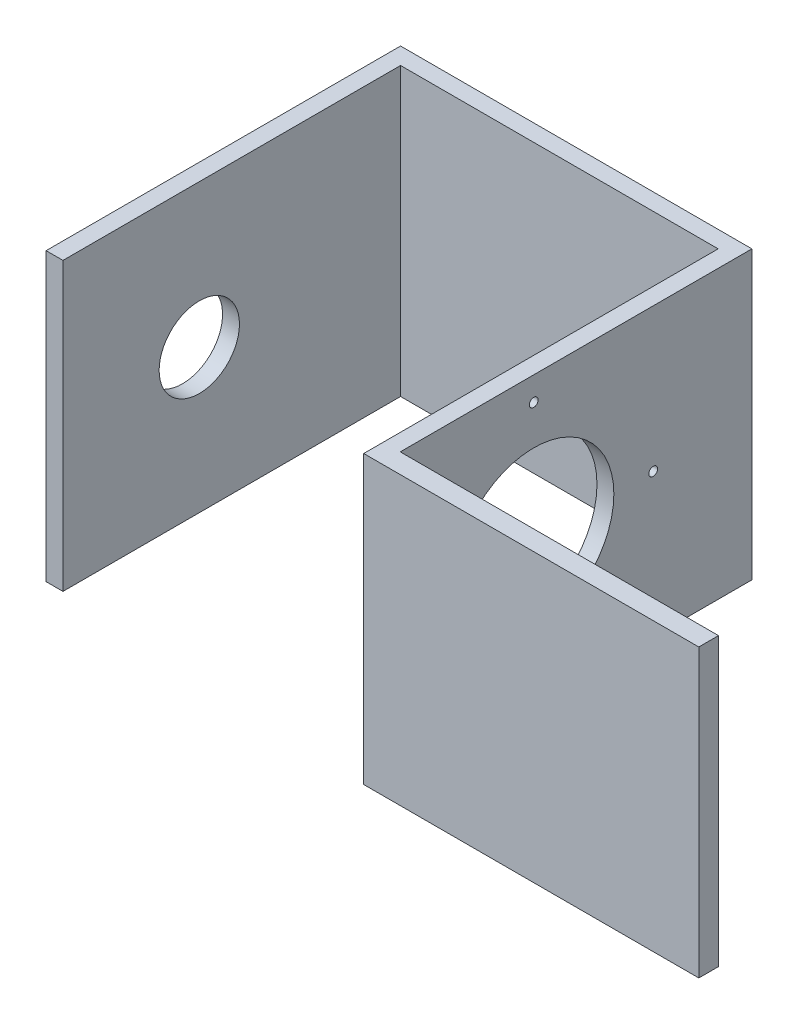
ISO-10303-21;
HEADER;
FILE_DESCRIPTION(('STEP AP214'),'2;1');
FILE_NAME('part.step','',(''),(''),'','','');
FILE_SCHEMA(('AUTOMOTIVE_DESIGN { 1 0 10303 214 1 1 1 1 }'));
ENDSEC;
DATA;
#1=APPLICATION_CONTEXT('core data for automotive mechanical design processes');
#2=APPLICATION_PROTOCOL_DEFINITION('international standard','automotive_design',2000,#1);
#3=PRODUCT_CONTEXT('',#1,'mechanical');
#4=PRODUCT('Part','Part','',(#3));
#5=PRODUCT_RELATED_PRODUCT_CATEGORY('part','',(#4));
#6=PRODUCT_DEFINITION_FORMATION('','',#4);
#7=PRODUCT_DEFINITION_CONTEXT('part definition',#1,'design');
#8=PRODUCT_DEFINITION('design','',#6,#7);
#9=PRODUCT_DEFINITION_SHAPE('','',#8);
#10=(LENGTH_UNIT() NAMED_UNIT(*) SI_UNIT(.MILLI.,.METRE.));
#11=(NAMED_UNIT(*) PLANE_ANGLE_UNIT() SI_UNIT($,.RADIAN.));
#12=(NAMED_UNIT(*) SI_UNIT($,.STERADIAN.) SOLID_ANGLE_UNIT());
#13=UNCERTAINTY_MEASURE_WITH_UNIT(LENGTH_MEASURE(1.E-05),#10,'distance_accuracy_value','');
#14=(GEOMETRIC_REPRESENTATION_CONTEXT(3) GLOBAL_UNCERTAINTY_ASSIGNED_CONTEXT((#13)) GLOBAL_UNIT_ASSIGNED_CONTEXT((#10,
#11,#12)) REPRESENTATION_CONTEXT('',''));
#15=CARTESIAN_POINT('',(0.,0.,0.));
#16=DIRECTION('',(0.,0.,1.));
#17=DIRECTION('',(1.,0.,0.));
#18=AXIS2_PLACEMENT_3D('',#15,#16,#17);
#19=CARTESIAN_POINT('',(175.723,51.,0.));
#20=DIRECTION('',(1.,0.,0.));
#21=DIRECTION('',(0.,0.,-1.));
#22=AXIS2_PLACEMENT_3D('',#19,#20,#21);
#23=PLANE('',#22);
#24=DIRECTION('',(0.,-1.,0.));
#25=VECTOR('',#24,1.);
#26=CARTESIAN_POINT('',(175.723,51.,54.5));
#27=LINE('',#26,#25);
#28=CARTESIAN_POINT('',(175.723,51.,54.5));
#29=VERTEX_POINT('',#28);
#30=CARTESIAN_POINT('',(175.723,-51.,54.5));
#31=VERTEX_POINT('',#30);
#32=EDGE_CURVE('E134',#29,#31,#27,.T.);
#33=ORIENTED_EDGE('',*,*,#32,.T.);
#34=DIRECTION('',(0.,0.,1.));
#35=VECTOR('',#34,1.);
#36=CARTESIAN_POINT('',(175.723,-51.,0.));
#37=LINE('',#36,#35);
#38=CARTESIAN_POINT('',(175.723,-51.,47.5));
#39=VERTEX_POINT('',#38);
#40=EDGE_CURVE('E133',#39,#31,#37,.T.);
#41=ORIENTED_EDGE('',*,*,#40,.F.);
#42=DIRECTION('',(0.,-1.,0.));
#43=VECTOR('',#42,1.);
#44=CARTESIAN_POINT('',(175.723,51.,47.5));
#45=LINE('',#44,#43);
#46=CARTESIAN_POINT('',(175.723,51.,47.5));
#47=VERTEX_POINT('',#46);
#48=EDGE_CURVE('E11',#47,#39,#45,.T.);
#49=ORIENTED_EDGE('',*,*,#48,.F.);
#50=DIRECTION('',(0.,0.,1.));
#51=VECTOR('',#50,1.);
#52=CARTESIAN_POINT('',(175.723,51.,0.));
#53=LINE('',#52,#51);
#54=EDGE_CURVE('E179',#47,#29,#53,.T.);
#55=ORIENTED_EDGE('',*,*,#54,.T.);
#56=EDGE_LOOP('',(#33,#41,#49,#55));
#57=FACE_BOUND('',#56,.T.);
#58=ADVANCED_FACE('F47',(#57),#23,.T.);
#59=CARTESIAN_POINT('',(0.,51.,47.5));
#60=DIRECTION('',(0.,0.,1.));
#61=DIRECTION('',(1.,0.,0.));
#62=AXIS2_PLACEMENT_3D('',#59,#60,#61);
#63=PLANE('',#62);
#64=ORIENTED_EDGE('',*,*,#48,.T.);
#65=DIRECTION('',(-1.,0.,0.));
#66=VECTOR('',#65,1.);
#67=CARTESIAN_POINT('',(0.,-51.,47.5));
#68=LINE('',#67,#66);
#69=CARTESIAN_POINT('',(62.5,-51.,47.5));
#70=VERTEX_POINT('',#69);
#71=EDGE_CURVE('E128',#39,#70,#68,.T.);
#72=ORIENTED_EDGE('',*,*,#71,.T.);
#73=DIRECTION('',(0.,-1.,0.));
#74=VECTOR('',#73,1.);
#75=CARTESIAN_POINT('',(62.5,51.,47.5));
#76=LINE('',#75,#74);
#77=CARTESIAN_POINT('',(62.5,51.,47.5));
#78=VERTEX_POINT('',#77);
#79=EDGE_CURVE('E55',#78,#70,#76,.T.);
#80=ORIENTED_EDGE('',*,*,#79,.F.);
#81=DIRECTION('',(-1.,0.,0.));
#82=VECTOR('',#81,1.);
#83=CARTESIAN_POINT('',(0.,51.,47.5));
#84=LINE('',#83,#82);
#85=EDGE_CURVE('E129',#47,#78,#84,.T.);
#86=ORIENTED_EDGE('',*,*,#85,.F.);
#87=EDGE_LOOP('',(#64,#72,#80,#86));
#88=FACE_BOUND('',#87,.T.);
#89=ADVANCED_FACE('F125',(#88),#63,.F.);
#90=CARTESIAN_POINT('',(62.5,51.,0.));
#91=DIRECTION('',(1.,0.,0.));
#92=DIRECTION('',(0.,0.,-1.));
#93=AXIS2_PLACEMENT_3D('',#90,#91,#92);
#94=PLANE('',#93);
#95=CARTESIAN_POINT('',(62.5,42.5,0.));
#96=DIRECTION('',(1.,0.,0.));
#97=DIRECTION('',(0.,0.,-1.));
#98=AXIS2_PLACEMENT_3D('',#95,#96,#97);
#99=CIRCLE('',#98,1.5635);
#100=CARTESIAN_POINT('',(62.5,42.5,-1.56350000000001));
#101=VERTEX_POINT('',#100);
#102=EDGE_CURVE('E425',#101,#101,#99,.T.);
#103=ORIENTED_EDGE('',*,*,#102,.F.);
#104=EDGE_LOOP('',(#103));
#105=FACE_BOUND('',#104,.T.);
#106=CARTESIAN_POINT('',(62.5,0.,42.5));
#107=DIRECTION('',(1.,0.,0.));
#108=DIRECTION('',(0.,0.,-1.));
#109=AXIS2_PLACEMENT_3D('',#106,#107,#108);
#110=CIRCLE('',#109,1.5635);
#111=CARTESIAN_POINT('',(62.5,0.,40.9365));
#112=VERTEX_POINT('',#111);
#113=EDGE_CURVE('E430',#112,#112,#110,.T.);
#114=ORIENTED_EDGE('',*,*,#113,.F.);
#115=EDGE_LOOP('',(#114));
#116=FACE_BOUND('',#115,.T.);
#117=CARTESIAN_POINT('',(62.5,-42.5,0.));
#118=DIRECTION('',(1.,0.,0.));
#119=DIRECTION('',(0.,0.,-1.));
#120=AXIS2_PLACEMENT_3D('',#117,#118,#119);
#121=CIRCLE('',#120,1.5635);
#122=CARTESIAN_POINT('',(62.5,-42.5,-1.56350000000001));
#123=VERTEX_POINT('',#122);
#124=EDGE_CURVE('E435',#123,#123,#121,.T.);
#125=ORIENTED_EDGE('',*,*,#124,.F.);
#126=EDGE_LOOP('',(#125));
#127=FACE_BOUND('',#126,.T.);
#128=CARTESIAN_POINT('',(62.5,0.,-42.5));
#129=DIRECTION('',(1.,0.,0.));
#130=DIRECTION('',(0.,0.,-1.));
#131=AXIS2_PLACEMENT_3D('',#128,#129,#130);
#132=CIRCLE('',#131,1.5635);
#133=CARTESIAN_POINT('',(62.5,0.,-44.0635));
#134=VERTEX_POINT('',#133);
#135=EDGE_CURVE('E421',#134,#134,#132,.T.);
#136=ORIENTED_EDGE('',*,*,#135,.F.);
#137=EDGE_LOOP('',(#136));
#138=FACE_BOUND('',#137,.T.);
#139=CARTESIAN_POINT('',(62.5,0.,0.));
#140=DIRECTION('',(1.,0.,0.));
#141=DIRECTION('',(0.,0.,-1.));
#142=AXIS2_PLACEMENT_3D('',#139,#140,#141);
#143=CIRCLE('',#142,28.5);
#144=CARTESIAN_POINT('',(62.5,0.,-28.5));
#145=VERTEX_POINT('',#144);
#146=EDGE_CURVE('E415',#145,#145,#143,.T.);
#147=ORIENTED_EDGE('',*,*,#146,.F.);
#148=EDGE_LOOP('',(#147));
#149=FACE_BOUND('',#148,.T.);
#150=ORIENTED_EDGE('',*,*,#79,.T.);
#151=DIRECTION('',(0.,0.,1.));
#152=VECTOR('',#151,1.);
#153=CARTESIAN_POINT('',(62.5,-51.,0.));
#154=LINE('',#153,#152);
#155=CARTESIAN_POINT('',(62.5,-51.,-77.6115));
#156=VERTEX_POINT('',#155);
#157=EDGE_CURVE('E145',#156,#70,#154,.T.);
#158=ORIENTED_EDGE('',*,*,#157,.F.);
#159=DIRECTION('',(0.,-1.,0.));
#160=VECTOR('',#159,1.);
#161=CARTESIAN_POINT('',(62.5,51.,-77.6115));
#162=LINE('',#161,#160);
#163=CARTESIAN_POINT('',(62.5,51.,-77.6115));
#164=VERTEX_POINT('',#163);
#165=EDGE_CURVE('E231',#164,#156,#162,.T.);
#166=ORIENTED_EDGE('',*,*,#165,.F.);
#167=DIRECTION('',(0.,0.,1.));
#168=VECTOR('',#167,1.);
#169=CARTESIAN_POINT('',(62.5,51.,0.));
#170=LINE('',#169,#168);
#171=EDGE_CURVE('E184',#164,#78,#170,.T.);
#172=ORIENTED_EDGE('',*,*,#171,.T.);
#173=EDGE_LOOP('',(#150,#158,#166,#172));
#174=FACE_BOUND('',#173,.T.);
#175=ADVANCED_FACE('F235',(#105,#116,#127,#138,#149,#174),#94,.T.);
#176=CARTESIAN_POINT('',(0.,51.,-77.6115));
#177=DIRECTION('',(0.,0.,1.));
#178=DIRECTION('',(1.,0.,0.));
#179=AXIS2_PLACEMENT_3D('',#176,#177,#178);
#180=PLANE('',#179);
#181=ORIENTED_EDGE('',*,*,#165,.T.);
#182=DIRECTION('',(-1.,0.,0.));
#183=VECTOR('',#182,1.);
#184=CARTESIAN_POINT('',(0.,-51.,-77.6115));
#185=LINE('',#184,#183);
#186=CARTESIAN_POINT('',(-62.5,-51.,-77.6115));
#187=VERTEX_POINT('',#186);
#188=EDGE_CURVE('E149',#156,#187,#185,.T.);
#189=ORIENTED_EDGE('',*,*,#188,.T.);
#190=DIRECTION('',(0.,-1.,0.));
#191=VECTOR('',#190,1.);
#192=CARTESIAN_POINT('',(-62.5,51.,-77.6115));
#193=LINE('',#192,#191);
#194=CARTESIAN_POINT('',(-62.5,51.,-77.6115));
#195=VERTEX_POINT('',#194);
#196=EDGE_CURVE('E228',#195,#187,#193,.T.);
#197=ORIENTED_EDGE('',*,*,#196,.F.);
#198=DIRECTION('',(-1.,0.,0.));
#199=VECTOR('',#198,1.);
#200=CARTESIAN_POINT('',(0.,51.,-77.6115));
#201=LINE('',#200,#199);
#202=EDGE_CURVE('E188',#164,#195,#201,.T.);
#203=ORIENTED_EDGE('',*,*,#202,.F.);
#204=EDGE_LOOP('',(#181,#189,#197,#203));
#205=FACE_BOUND('',#204,.T.);
#206=ADVANCED_FACE('F243',(#205),#180,.F.);
#207=CARTESIAN_POINT('',(-62.5,51.,0.));
#208=DIRECTION('',(-1.,0.,0.));
#209=DIRECTION('',(0.,0.,1.));
#210=AXIS2_PLACEMENT_3D('',#207,#208,#209);
#211=PLANE('',#210);
#212=CARTESIAN_POINT('',(-62.5,0.,0.));
#213=DIRECTION('',(-1.,0.,0.));
#214=DIRECTION('',(0.,0.,1.));
#215=AXIS2_PLACEMENT_3D('',#212,#213,#214);
#216=CIRCLE('',#215,14.2875);
#217=CARTESIAN_POINT('',(-62.5,0.,14.2875));
#218=VERTEX_POINT('',#217);
#219=EDGE_CURVE('E450',#218,#218,#216,.T.);
#220=ORIENTED_EDGE('',*,*,#219,.F.);
#221=EDGE_LOOP('',(#220));
#222=FACE_BOUND('',#221,.T.);
#223=ORIENTED_EDGE('',*,*,#196,.T.);
#224=DIRECTION('',(0.,0.,-1.));
#225=VECTOR('',#224,1.);
#226=CARTESIAN_POINT('',(-62.5,-51.,0.));
#227=LINE('',#226,#225);
#228=CARTESIAN_POINT('',(-62.5,-51.,48.5));
#229=VERTEX_POINT('',#228);
#230=EDGE_CURVE('E156',#229,#187,#227,.T.);
#231=ORIENTED_EDGE('',*,*,#230,.F.);
#232=DIRECTION('',(0.,-1.,0.));
#233=VECTOR('',#232,1.);
#234=CARTESIAN_POINT('',(-62.5,51.,48.5));
#235=LINE('',#234,#233);
#236=CARTESIAN_POINT('',(-62.5,51.,48.5));
#237=VERTEX_POINT('',#236);
#238=EDGE_CURVE('E225',#237,#229,#235,.T.);
#239=ORIENTED_EDGE('',*,*,#238,.F.);
#240=DIRECTION('',(0.,0.,-1.));
#241=VECTOR('',#240,1.);
#242=CARTESIAN_POINT('',(-62.5,51.,0.));
#243=LINE('',#242,#241);
#244=EDGE_CURVE('E191',#237,#195,#243,.T.);
#245=ORIENTED_EDGE('',*,*,#244,.T.);
#246=EDGE_LOOP('',(#223,#231,#239,#245));
#247=FACE_BOUND('',#246,.T.);
#248=ADVANCED_FACE('F246',(#222,#247),#211,.T.);
#249=CARTESIAN_POINT('',(0.,51.,48.5));
#250=DIRECTION('',(0.,0.,1.));
#251=DIRECTION('',(1.,0.,0.));
#252=AXIS2_PLACEMENT_3D('',#249,#250,#251);
#253=PLANE('',#252);
#254=ORIENTED_EDGE('',*,*,#238,.T.);
#255=DIRECTION('',(-1.,0.,0.));
#256=VECTOR('',#255,1.);
#257=CARTESIAN_POINT('',(0.,-51.,48.5));
#258=LINE('',#257,#256);
#259=CARTESIAN_POINT('',(-56.5,-51.,48.5));
#260=VERTEX_POINT('',#259);
#261=EDGE_CURVE('E160',#260,#229,#258,.T.);
#262=ORIENTED_EDGE('',*,*,#261,.F.);
#263=DIRECTION('',(0.,-1.,0.));
#264=VECTOR('',#263,1.);
#265=CARTESIAN_POINT('',(-56.5,51.,48.5));
#266=LINE('',#265,#264);
#267=CARTESIAN_POINT('',(-56.5,51.,48.5));
#268=VERTEX_POINT('',#267);
#269=EDGE_CURVE('E222',#268,#260,#266,.T.);
#270=ORIENTED_EDGE('',*,*,#269,.F.);
#271=DIRECTION('',(-1.,0.,0.));
#272=VECTOR('',#271,1.);
#273=CARTESIAN_POINT('',(0.,51.,48.5));
#274=LINE('',#273,#272);
#275=EDGE_CURVE('E195',#268,#237,#274,.T.);
#276=ORIENTED_EDGE('',*,*,#275,.T.);
#277=EDGE_LOOP('',(#254,#262,#270,#276));
#278=FACE_BOUND('',#277,.T.);
#279=ADVANCED_FACE('F249',(#278),#253,.T.);
#280=CARTESIAN_POINT('',(-56.5,51.,0.));
#281=DIRECTION('',(1.,0.,0.));
#282=DIRECTION('',(0.,0.,-1.));
#283=AXIS2_PLACEMENT_3D('',#280,#281,#282);
#284=PLANE('',#283);
#285=CARTESIAN_POINT('',(-56.5,0.,0.));
#286=DIRECTION('',(1.,0.,0.));
#287=DIRECTION('',(0.,0.,-1.));
#288=AXIS2_PLACEMENT_3D('',#285,#286,#287);
#289=CIRCLE('',#288,14.2875);
#290=CARTESIAN_POINT('',(-56.5,0.,-14.2875));
#291=VERTEX_POINT('',#290);
#292=EDGE_CURVE('E457',#291,#291,#289,.F.);
#293=ORIENTED_EDGE('',*,*,#292,.T.);
#294=EDGE_LOOP('',(#293));
#295=FACE_BOUND('',#294,.T.);
#296=ORIENTED_EDGE('',*,*,#269,.T.);
#297=DIRECTION('',(0.,0.,1.));
#298=VECTOR('',#297,1.);
#299=CARTESIAN_POINT('',(-56.5,-51.,0.));
#300=LINE('',#299,#298);
#301=CARTESIAN_POINT('',(-56.5,-51.,-71.6115));
#302=VERTEX_POINT('',#301);
#303=EDGE_CURVE('E164',#302,#260,#300,.T.);
#304=ORIENTED_EDGE('',*,*,#303,.F.);
#305=DIRECTION('',(0.,-1.,0.));
#306=VECTOR('',#305,1.);
#307=CARTESIAN_POINT('',(-56.5,51.,-71.6115));
#308=LINE('',#307,#306);
#309=CARTESIAN_POINT('',(-56.5,51.,-71.6115));
#310=VERTEX_POINT('',#309);
#311=EDGE_CURVE('E219',#310,#302,#308,.T.);
#312=ORIENTED_EDGE('',*,*,#311,.F.);
#313=DIRECTION('',(0.,0.,1.));
#314=VECTOR('',#313,1.);
#315=CARTESIAN_POINT('',(-56.5,51.,0.));
#316=LINE('',#315,#314);
#317=EDGE_CURVE('E199',#310,#268,#316,.T.);
#318=ORIENTED_EDGE('',*,*,#317,.T.);
#319=EDGE_LOOP('',(#296,#304,#312,#318));
#320=FACE_BOUND('',#319,.T.);
#321=ADVANCED_FACE('F254',(#295,#320),#284,.T.);
#322=CARTESIAN_POINT('',(0.,51.,-71.6115));
#323=DIRECTION('',(0.,0.,1.));
#324=DIRECTION('',(1.,0.,0.));
#325=AXIS2_PLACEMENT_3D('',#322,#323,#324);
#326=PLANE('',#325);
#327=ORIENTED_EDGE('',*,*,#311,.T.);
#328=DIRECTION('',(-1.,0.,0.));
#329=VECTOR('',#328,1.);
#330=CARTESIAN_POINT('',(0.,-51.,-71.6115));
#331=LINE('',#330,#329);
#332=CARTESIAN_POINT('',(56.5,-51.,-71.6115));
#333=VERTEX_POINT('',#332);
#334=EDGE_CURVE('E168',#333,#302,#331,.T.);
#335=ORIENTED_EDGE('',*,*,#334,.F.);
#336=DIRECTION('',(0.,-1.,0.));
#337=VECTOR('',#336,1.);
#338=CARTESIAN_POINT('',(56.5,51.,-71.6115));
#339=LINE('',#338,#337);
#340=CARTESIAN_POINT('',(56.5,51.,-71.6115));
#341=VERTEX_POINT('',#340);
#342=EDGE_CURVE('E216',#341,#333,#339,.T.);
#343=ORIENTED_EDGE('',*,*,#342,.F.);
#344=DIRECTION('',(-1.,0.,0.));
#345=VECTOR('',#344,1.);
#346=CARTESIAN_POINT('',(0.,51.,-71.6115));
#347=LINE('',#346,#345);
#348=EDGE_CURVE('E203',#341,#310,#347,.T.);
#349=ORIENTED_EDGE('',*,*,#348,.T.);
#350=EDGE_LOOP('',(#327,#335,#343,#349));
#351=FACE_BOUND('',#350,.T.);
#352=ADVANCED_FACE('F257',(#351),#326,.T.);
#353=CARTESIAN_POINT('',(56.5,51.,0.));
#354=DIRECTION('',(1.,0.,0.));
#355=DIRECTION('',(0.,0.,-1.));
#356=AXIS2_PLACEMENT_3D('',#353,#354,#355);
#357=PLANE('',#356);
#358=CARTESIAN_POINT('',(56.5,42.5,0.));
#359=DIRECTION('',(1.,0.,0.));
#360=DIRECTION('',(0.,0.,-1.));
#361=AXIS2_PLACEMENT_3D('',#358,#359,#360);
#362=CIRCLE('',#361,1.5635);
#363=CARTESIAN_POINT('',(56.5,42.5,-1.56350000000001));
#364=VERTEX_POINT('',#363);
#365=EDGE_CURVE('E139',#364,#364,#362,.F.);
#366=ORIENTED_EDGE('',*,*,#365,.F.);
#367=EDGE_LOOP('',(#366));
#368=FACE_BOUND('',#367,.T.);
#369=CARTESIAN_POINT('',(56.5,0.,42.5));
#370=DIRECTION('',(1.,0.,0.));
#371=DIRECTION('',(0.,0.,-1.));
#372=AXIS2_PLACEMENT_3D('',#369,#370,#371);
#373=CIRCLE('',#372,1.5635);
#374=CARTESIAN_POINT('',(56.5,0.,40.9365));
#375=VERTEX_POINT('',#374);
#376=EDGE_CURVE('E447',#375,#375,#373,.F.);
#377=ORIENTED_EDGE('',*,*,#376,.F.);
#378=EDGE_LOOP('',(#377));
#379=FACE_BOUND('',#378,.T.);
#380=CARTESIAN_POINT('',(56.5,-42.5,0.));
#381=DIRECTION('',(1.,0.,0.));
#382=DIRECTION('',(0.,0.,-1.));
#383=AXIS2_PLACEMENT_3D('',#380,#381,#382);
#384=CIRCLE('',#383,1.5635);
#385=CARTESIAN_POINT('',(56.5,-42.5,-1.56350000000001));
#386=VERTEX_POINT('',#385);
#387=EDGE_CURVE('E440',#386,#386,#384,.F.);
#388=ORIENTED_EDGE('',*,*,#387,.F.);
#389=EDGE_LOOP('',(#388));
#390=FACE_BOUND('',#389,.T.);
#391=CARTESIAN_POINT('',(56.5,0.,-42.5));
#392=DIRECTION('',(1.,0.,0.));
#393=DIRECTION('',(0.,0.,-1.));
#394=AXIS2_PLACEMENT_3D('',#391,#392,#393);
#395=CIRCLE('',#394,1.5635);
#396=CARTESIAN_POINT('',(56.5,0.,-44.0635));
#397=VERTEX_POINT('',#396);
#398=EDGE_CURVE('E428',#397,#397,#395,.F.);
#399=ORIENTED_EDGE('',*,*,#398,.F.);
#400=EDGE_LOOP('',(#399));
#401=FACE_BOUND('',#400,.T.);
#402=CARTESIAN_POINT('',(56.5,0.,0.));
#403=DIRECTION('',(1.,0.,0.));
#404=DIRECTION('',(0.,0.,-1.));
#405=AXIS2_PLACEMENT_3D('',#402,#403,#404);
#406=CIRCLE('',#405,28.5);
#407=CARTESIAN_POINT('',(56.5,0.,-28.5));
#408=VERTEX_POINT('',#407);
#409=EDGE_CURVE('E418',#408,#408,#406,.F.);
#410=ORIENTED_EDGE('',*,*,#409,.F.);
#411=EDGE_LOOP('',(#410));
#412=FACE_BOUND('',#411,.T.);
#413=ORIENTED_EDGE('',*,*,#342,.T.);
#414=DIRECTION('',(0.,0.,1.));
#415=VECTOR('',#414,1.);
#416=CARTESIAN_POINT('',(56.5,-51.,0.));
#417=LINE('',#416,#415);
#418=CARTESIAN_POINT('',(56.5,-51.,54.5));
#419=VERTEX_POINT('',#418);
#420=EDGE_CURVE('E172',#333,#419,#417,.T.);
#421=ORIENTED_EDGE('',*,*,#420,.T.);
#422=DIRECTION('',(0.,-1.,0.));
#423=VECTOR('',#422,1.);
#424=CARTESIAN_POINT('',(56.5,51.,54.5));
#425=LINE('',#424,#423);
#426=CARTESIAN_POINT('',(56.5,51.,54.5));
#427=VERTEX_POINT('',#426);
#428=EDGE_CURVE('E213',#427,#419,#425,.T.);
#429=ORIENTED_EDGE('',*,*,#428,.F.);
#430=DIRECTION('',(0.,0.,1.));
#431=VECTOR('',#430,1.);
#432=CARTESIAN_POINT('',(56.5,51.,0.));
#433=LINE('',#432,#431);
#434=EDGE_CURVE('E67',#341,#427,#433,.T.);
#435=ORIENTED_EDGE('',*,*,#434,.F.);
#436=EDGE_LOOP('',(#413,#421,#429,#435));
#437=FACE_BOUND('',#436,.T.);
#438=ADVANCED_FACE('F259',(#368,#379,#390,#401,#412,#437),#357,.F.);
#439=CARTESIAN_POINT('',(0.,51.,54.5));
#440=DIRECTION('',(0.,0.,-1.));
#441=DIRECTION('',(-1.,0.,0.));
#442=AXIS2_PLACEMENT_3D('',#439,#440,#441);
#443=PLANE('',#442);
#444=ORIENTED_EDGE('',*,*,#428,.T.);
#445=DIRECTION('',(1.,0.,0.));
#446=VECTOR('',#445,1.);
#447=CARTESIAN_POINT('',(0.,-51.,54.5));
#448=LINE('',#447,#446);
#449=EDGE_CURVE('E176',#419,#31,#448,.T.);
#450=ORIENTED_EDGE('',*,*,#449,.T.);
#451=ORIENTED_EDGE('',*,*,#32,.F.);
#452=DIRECTION('',(1.,0.,0.));
#453=VECTOR('',#452,1.);
#454=CARTESIAN_POINT('',(0.,51.,54.5));
#455=LINE('',#454,#453);
#456=EDGE_CURVE('E62',#427,#29,#455,.T.);
#457=ORIENTED_EDGE('',*,*,#456,.F.);
#458=EDGE_LOOP('',(#444,#450,#451,#457));
#459=FACE_BOUND('',#458,.T.);
#460=ADVANCED_FACE('F261',(#459),#443,.F.);
#461=CARTESIAN_POINT('',(0.,51.,0.));
#462=DIRECTION('',(0.,1.,0.));
#463=DIRECTION('',(0.,0.,1.));
#464=AXIS2_PLACEMENT_3D('',#461,#462,#463);
#465=PLANE('',#464);
#466=ORIENTED_EDGE('',*,*,#54,.F.);
#467=ORIENTED_EDGE('',*,*,#85,.T.);
#468=ORIENTED_EDGE('',*,*,#171,.F.);
#469=ORIENTED_EDGE('',*,*,#202,.T.);
#470=ORIENTED_EDGE('',*,*,#244,.F.);
#471=ORIENTED_EDGE('',*,*,#275,.F.);
#472=ORIENTED_EDGE('',*,*,#317,.F.);
#473=ORIENTED_EDGE('',*,*,#348,.F.);
#474=ORIENTED_EDGE('',*,*,#434,.T.);
#475=ORIENTED_EDGE('',*,*,#456,.T.);
#476=EDGE_LOOP('',(#466,#467,#468,#469,#470,#471,#472,#473,#474,#475));
#477=FACE_BOUND('',#476,.T.);
#478=ADVANCED_FACE('F238',(#477),#465,.T.);
#479=CARTESIAN_POINT('',(0.,-51.,0.));
#480=DIRECTION('',(0.,1.,0.));
#481=DIRECTION('',(0.,0.,1.));
#482=AXIS2_PLACEMENT_3D('',#479,#480,#481);
#483=PLANE('',#482);
#484=ORIENTED_EDGE('',*,*,#40,.T.);
#485=ORIENTED_EDGE('',*,*,#449,.F.);
#486=ORIENTED_EDGE('',*,*,#420,.F.);
#487=ORIENTED_EDGE('',*,*,#334,.T.);
#488=ORIENTED_EDGE('',*,*,#303,.T.);
#489=ORIENTED_EDGE('',*,*,#261,.T.);
#490=ORIENTED_EDGE('',*,*,#230,.T.);
#491=ORIENTED_EDGE('',*,*,#188,.F.);
#492=ORIENTED_EDGE('',*,*,#157,.T.);
#493=ORIENTED_EDGE('',*,*,#71,.F.);
#494=EDGE_LOOP('',(#484,#485,#486,#487,#488,#489,#490,#491,#492,#493));
#495=FACE_BOUND('',#494,.T.);
#496=ADVANCED_FACE('F142',(#495),#483,.F.);
#497=CARTESIAN_POINT('',(-62.501,0.,0.));
#498=DIRECTION('',(1.,0.,0.));
#499=DIRECTION('',(0.,0.,-1.));
#500=AXIS2_PLACEMENT_3D('',#497,#498,#499);
#501=CYLINDRICAL_SURFACE('',#500,28.5);
#502=ORIENTED_EDGE('',*,*,#146,.T.);
#503=EDGE_LOOP('',(#502));
#504=FACE_BOUND('',#503,.T.);
#505=ORIENTED_EDGE('',*,*,#409,.T.);
#506=EDGE_LOOP('',(#505));
#507=FACE_BOUND('',#506,.T.);
#508=ADVANCED_FACE('F372',(#504,#507),#501,.F.);
#509=CARTESIAN_POINT('',(-62.501,0.,-42.5));
#510=DIRECTION('',(1.,0.,0.));
#511=DIRECTION('',(0.,0.,-1.));
#512=AXIS2_PLACEMENT_3D('',#509,#510,#511);
#513=CYLINDRICAL_SURFACE('',#512,1.5635);
#514=ORIENTED_EDGE('',*,*,#135,.T.);
#515=EDGE_LOOP('',(#514));
#516=FACE_BOUND('',#515,.T.);
#517=ORIENTED_EDGE('',*,*,#398,.T.);
#518=EDGE_LOOP('',(#517));
#519=FACE_BOUND('',#518,.T.);
#520=ADVANCED_FACE('F362',(#516,#519),#513,.F.);
#521=CARTESIAN_POINT('',(-62.501,-42.5,0.));
#522=DIRECTION('',(1.,0.,0.));
#523=DIRECTION('',(0.,0.,-1.));
#524=AXIS2_PLACEMENT_3D('',#521,#522,#523);
#525=CYLINDRICAL_SURFACE('',#524,1.5635);
#526=ORIENTED_EDGE('',*,*,#124,.T.);
#527=EDGE_LOOP('',(#526));
#528=FACE_BOUND('',#527,.T.);
#529=ORIENTED_EDGE('',*,*,#387,.T.);
#530=EDGE_LOOP('',(#529));
#531=FACE_BOUND('',#530,.T.);
#532=ADVANCED_FACE('F352',(#528,#531),#525,.F.);
#533=CARTESIAN_POINT('',(-62.501,0.,42.5));
#534=DIRECTION('',(1.,0.,0.));
#535=DIRECTION('',(0.,0.,-1.));
#536=AXIS2_PLACEMENT_3D('',#533,#534,#535);
#537=CYLINDRICAL_SURFACE('',#536,1.5635);
#538=ORIENTED_EDGE('',*,*,#113,.T.);
#539=EDGE_LOOP('',(#538));
#540=FACE_BOUND('',#539,.T.);
#541=ORIENTED_EDGE('',*,*,#376,.T.);
#542=EDGE_LOOP('',(#541));
#543=FACE_BOUND('',#542,.T.);
#544=ADVANCED_FACE('F344',(#540,#543),#537,.F.);
#545=CARTESIAN_POINT('',(-62.501,42.5,0.));
#546=DIRECTION('',(1.,0.,0.));
#547=DIRECTION('',(0.,0.,-1.));
#548=AXIS2_PLACEMENT_3D('',#545,#546,#547);
#549=CYLINDRICAL_SURFACE('',#548,1.5635);
#550=ORIENTED_EDGE('',*,*,#102,.T.);
#551=EDGE_LOOP('',(#550));
#552=FACE_BOUND('',#551,.T.);
#553=ORIENTED_EDGE('',*,*,#365,.T.);
#554=EDGE_LOOP('',(#553));
#555=FACE_BOUND('',#554,.T.);
#556=ADVANCED_FACE('F322',(#552,#555),#549,.F.);
#557=CARTESIAN_POINT('',(175.724,0.,0.));
#558=DIRECTION('',(-1.,0.,0.));
#559=DIRECTION('',(0.,0.,1.));
#560=AXIS2_PLACEMENT_3D('',#557,#558,#559);
#561=CYLINDRICAL_SURFACE('',#560,14.2875);
#562=ORIENTED_EDGE('',*,*,#292,.F.);
#563=EDGE_LOOP('',(#562));
#564=FACE_BOUND('',#563,.T.);
#565=ORIENTED_EDGE('',*,*,#219,.T.);
#566=EDGE_LOOP('',(#565));
#567=FACE_BOUND('',#566,.T.);
#568=ADVANCED_FACE('F331',(#564,#567),#561,.F.);
#569=CLOSED_SHELL('',(#58,#89,#175,#206,#248,#279,#321,#352,#438,#460,#478,#496,#508,#520,#532,
#544,#556,#568));
#570=MANIFOLD_SOLID_BREP('B2',#569);
#571=ADVANCED_BREP_SHAPE_REPRESENTATION('',(#18,#570),#14);
#572=SHAPE_DEFINITION_REPRESENTATION(#9,#571);
ENDSEC;
END-ISO-10303-21;
